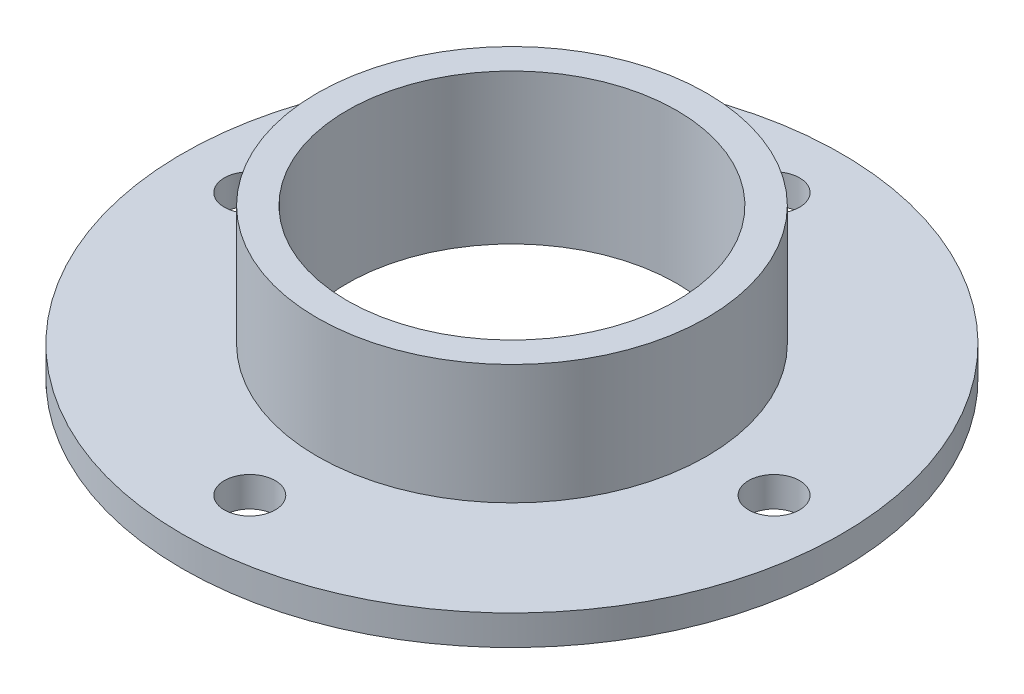
ISO-10303-21;
HEADER;
FILE_DESCRIPTION(('STEP AP214'),'2;1');
FILE_NAME('part.step','',(''),(''),'','','');
FILE_SCHEMA(('AUTOMOTIVE_DESIGN { 1 0 10303 214 1 1 1 1 }'));
ENDSEC;
DATA;
#1=APPLICATION_CONTEXT('core data for automotive mechanical design processes');
#2=APPLICATION_PROTOCOL_DEFINITION('international standard','automotive_design',2000,#1);
#3=PRODUCT_CONTEXT('',#1,'mechanical');
#4=PRODUCT('Part','Part','',(#3));
#5=PRODUCT_RELATED_PRODUCT_CATEGORY('part','',(#4));
#6=PRODUCT_DEFINITION_FORMATION('','',#4);
#7=PRODUCT_DEFINITION_CONTEXT('part definition',#1,'design');
#8=PRODUCT_DEFINITION('design','',#6,#7);
#9=PRODUCT_DEFINITION_SHAPE('','',#8);
#10=(LENGTH_UNIT() NAMED_UNIT(*) SI_UNIT(.MILLI.,.METRE.));
#11=(NAMED_UNIT(*) PLANE_ANGLE_UNIT() SI_UNIT($,.RADIAN.));
#12=(NAMED_UNIT(*) SI_UNIT($,.STERADIAN.) SOLID_ANGLE_UNIT());
#13=UNCERTAINTY_MEASURE_WITH_UNIT(LENGTH_MEASURE(1.E-05),#10,'distance_accuracy_value','');
#14=(GEOMETRIC_REPRESENTATION_CONTEXT(3) GLOBAL_UNCERTAINTY_ASSIGNED_CONTEXT((#13)) GLOBAL_UNIT_ASSIGNED_CONTEXT((#10,
#11,#12)) REPRESENTATION_CONTEXT('',''));
#15=CARTESIAN_POINT('',(0.,0.,0.));
#16=DIRECTION('',(0.,0.,1.));
#17=DIRECTION('',(1.,0.,0.));
#18=AXIS2_PLACEMENT_3D('',#15,#16,#17);
#19=CARTESIAN_POINT('',(0.,17.9540192467724,0.));
#20=DIRECTION('',(0.,1.,0.));
#21=DIRECTION('',(0.,0.,1.));
#22=AXIS2_PLACEMENT_3D('',#19,#20,#21);
#23=CYLINDRICAL_SURFACE('',#22,11.);
#24=CARTESIAN_POINT('',(0.,8.,0.));
#25=DIRECTION('',(0.,1.,0.));
#26=DIRECTION('',(0.,0.,1.));
#27=AXIS2_PLACEMENT_3D('',#24,#25,#26);
#28=CIRCLE('',#27,11.);
#29=CARTESIAN_POINT('',(0.,8.,11.));
#30=VERTEX_POINT('',#29);
#31=EDGE_CURVE('E10',#30,#30,#28,.T.);
#32=ORIENTED_EDGE('',*,*,#31,.T.);
#33=EDGE_LOOP('',(#32));
#34=FACE_BOUND('',#33,.T.);
#35=CARTESIAN_POINT('',(0.,-2.,0.));
#36=DIRECTION('',(0.,1.,0.));
#37=DIRECTION('',(0.,0.,1.));
#38=AXIS2_PLACEMENT_3D('',#35,#36,#37);
#39=CIRCLE('',#38,11.);
#40=CARTESIAN_POINT('',(0.,-2.,11.));
#41=VERTEX_POINT('',#40);
#42=EDGE_CURVE('E57',#41,#41,#39,.T.);
#43=ORIENTED_EDGE('',*,*,#42,.F.);
#44=EDGE_LOOP('',(#43));
#45=FACE_BOUND('',#44,.T.);
#46=ADVANCED_FACE('F35',(#34,#45),#23,.F.);
#47=CARTESIAN_POINT('',(11.,8.,0.));
#48=DIRECTION('',(0.,-1.,0.));
#49=DIRECTION('',(0.,0.,-1.));
#50=AXIS2_PLACEMENT_3D('',#47,#48,#49);
#51=PLANE('',#50);
#52=ORIENTED_EDGE('',*,*,#31,.F.);
#53=EDGE_LOOP('',(#52));
#54=FACE_BOUND('',#53,.T.);
#55=CARTESIAN_POINT('',(0.,8.,0.));
#56=DIRECTION('',(0.,1.,0.));
#57=DIRECTION('',(0.,0.,1.));
#58=AXIS2_PLACEMENT_3D('',#55,#56,#57);
#59=CIRCLE('',#58,13.);
#60=CARTESIAN_POINT('',(0.,8.,13.));
#61=VERTEX_POINT('',#60);
#62=EDGE_CURVE('E41',#61,#61,#59,.T.);
#63=ORIENTED_EDGE('',*,*,#62,.T.);
#64=EDGE_LOOP('',(#63));
#65=FACE_BOUND('',#64,.T.);
#66=ADVANCED_FACE('F121',(#54,#65),#51,.F.);
#67=CARTESIAN_POINT('',(0.,17.9540192467724,0.));
#68=DIRECTION('',(0.,1.,0.));
#69=DIRECTION('',(0.,0.,1.));
#70=AXIS2_PLACEMENT_3D('',#67,#68,#69);
#71=CYLINDRICAL_SURFACE('',#70,13.);
#72=ORIENTED_EDGE('',*,*,#62,.F.);
#73=EDGE_LOOP('',(#72));
#74=FACE_BOUND('',#73,.T.);
#75=CARTESIAN_POINT('',(0.,0.,0.));
#76=DIRECTION('',(0.,1.,0.));
#77=DIRECTION('',(0.,0.,1.));
#78=AXIS2_PLACEMENT_3D('',#75,#76,#77);
#79=CIRCLE('',#78,13.);
#80=CARTESIAN_POINT('',(0.,0.,13.));
#81=VERTEX_POINT('',#80);
#82=EDGE_CURVE('E45',#81,#81,#79,.T.);
#83=ORIENTED_EDGE('',*,*,#82,.T.);
#84=EDGE_LOOP('',(#83));
#85=FACE_BOUND('',#84,.T.);
#86=ADVANCED_FACE('F91',(#74,#85),#71,.T.);
#87=CARTESIAN_POINT('',(13.,0.,0.));
#88=DIRECTION('',(0.,-1.,0.));
#89=DIRECTION('',(0.,0.,-1.));
#90=AXIS2_PLACEMENT_3D('',#87,#88,#89);
#91=PLANE('',#90);
#92=CARTESIAN_POINT('',(0.,0.,-17.5));
#93=DIRECTION('',(0.,1.,0.));
#94=DIRECTION('',(0.,0.,1.));
#95=AXIS2_PLACEMENT_3D('',#92,#93,#94);
#96=CIRCLE('',#95,1.7);
#97=CARTESIAN_POINT('',(0.,0.,-15.8));
#98=VERTEX_POINT('',#97);
#99=EDGE_CURVE('E81',#98,#98,#96,.T.);
#100=ORIENTED_EDGE('',*,*,#99,.F.);
#101=EDGE_LOOP('',(#100));
#102=FACE_BOUND('',#101,.T.);
#103=CARTESIAN_POINT('',(17.5,0.,0.));
#104=DIRECTION('',(0.,1.,0.));
#105=DIRECTION('',(0.,0.,1.));
#106=AXIS2_PLACEMENT_3D('',#103,#104,#105);
#107=CIRCLE('',#106,1.7);
#108=CARTESIAN_POINT('',(17.5,0.,1.7));
#109=VERTEX_POINT('',#108);
#110=EDGE_CURVE('E75',#109,#109,#107,.T.);
#111=ORIENTED_EDGE('',*,*,#110,.F.);
#112=EDGE_LOOP('',(#111));
#113=FACE_BOUND('',#112,.T.);
#114=CARTESIAN_POINT('',(0.,0.,17.5));
#115=DIRECTION('',(0.,1.,0.));
#116=DIRECTION('',(0.,0.,1.));
#117=AXIS2_PLACEMENT_3D('',#114,#115,#116);
#118=CIRCLE('',#117,1.7);
#119=CARTESIAN_POINT('',(0.,0.,19.2));
#120=VERTEX_POINT('',#119);
#121=EDGE_CURVE('E69',#120,#120,#118,.T.);
#122=ORIENTED_EDGE('',*,*,#121,.F.);
#123=EDGE_LOOP('',(#122));
#124=FACE_BOUND('',#123,.T.);
#125=CARTESIAN_POINT('',(-17.5,0.,0.));
#126=DIRECTION('',(0.,1.,0.));
#127=DIRECTION('',(0.,0.,1.));
#128=AXIS2_PLACEMENT_3D('',#125,#126,#127);
#129=CIRCLE('',#128,1.7);
#130=CARTESIAN_POINT('',(-17.5,0.,1.7));
#131=VERTEX_POINT('',#130);
#132=EDGE_CURVE('E63',#131,#131,#129,.T.);
#133=ORIENTED_EDGE('',*,*,#132,.F.);
#134=EDGE_LOOP('',(#133));
#135=FACE_BOUND('',#134,.T.);
#136=ORIENTED_EDGE('',*,*,#82,.F.);
#137=EDGE_LOOP('',(#136));
#138=FACE_BOUND('',#137,.T.);
#139=CARTESIAN_POINT('',(0.,0.,0.));
#140=DIRECTION('',(0.,1.,0.));
#141=DIRECTION('',(0.,0.,1.));
#142=AXIS2_PLACEMENT_3D('',#139,#140,#141);
#143=CIRCLE('',#142,22.);
#144=CARTESIAN_POINT('',(0.,0.,22.));
#145=VERTEX_POINT('',#144);
#146=EDGE_CURVE('E49',#145,#145,#143,.T.);
#147=ORIENTED_EDGE('',*,*,#146,.T.);
#148=EDGE_LOOP('',(#147));
#149=FACE_BOUND('',#148,.T.);
#150=ADVANCED_FACE('F87',(#102,#113,#124,#135,#138,#149),#91,.F.);
#151=CARTESIAN_POINT('',(0.,17.9540192467724,0.));
#152=DIRECTION('',(0.,1.,0.));
#153=DIRECTION('',(0.,0.,1.));
#154=AXIS2_PLACEMENT_3D('',#151,#152,#153);
#155=CYLINDRICAL_SURFACE('',#154,22.);
#156=ORIENTED_EDGE('',*,*,#146,.F.);
#157=EDGE_LOOP('',(#156));
#158=FACE_BOUND('',#157,.T.);
#159=CARTESIAN_POINT('',(0.,-2.,0.));
#160=DIRECTION('',(0.,1.,0.));
#161=DIRECTION('',(0.,0.,1.));
#162=AXIS2_PLACEMENT_3D('',#159,#160,#161);
#163=CIRCLE('',#162,22.);
#164=CARTESIAN_POINT('',(0.,-2.,22.));
#165=VERTEX_POINT('',#164);
#166=EDGE_CURVE('E54',#165,#165,#163,.T.);
#167=ORIENTED_EDGE('',*,*,#166,.T.);
#168=EDGE_LOOP('',(#167));
#169=FACE_BOUND('',#168,.T.);
#170=ADVANCED_FACE('F90',(#158,#169),#155,.T.);
#171=CARTESIAN_POINT('',(22.,-2.,0.));
#172=DIRECTION('',(0.,1.,0.));
#173=DIRECTION('',(0.,0.,1.));
#174=AXIS2_PLACEMENT_3D('',#171,#172,#173);
#175=PLANE('',#174);
#176=CARTESIAN_POINT('',(0.,-2.,-17.5));
#177=DIRECTION('',(0.,1.,0.));
#178=DIRECTION('',(0.,0.,1.));
#179=AXIS2_PLACEMENT_3D('',#176,#177,#178);
#180=CIRCLE('',#179,1.7);
#181=CARTESIAN_POINT('',(0.,-2.,-15.8));
#182=VERTEX_POINT('',#181);
#183=EDGE_CURVE('E78',#182,#182,#180,.T.);
#184=ORIENTED_EDGE('',*,*,#183,.T.);
#185=EDGE_LOOP('',(#184));
#186=FACE_BOUND('',#185,.T.);
#187=CARTESIAN_POINT('',(17.5,-2.,0.));
#188=DIRECTION('',(0.,1.,0.));
#189=DIRECTION('',(0.,0.,1.));
#190=AXIS2_PLACEMENT_3D('',#187,#188,#189);
#191=CIRCLE('',#190,1.7);
#192=CARTESIAN_POINT('',(17.5,-2.,1.7));
#193=VERTEX_POINT('',#192);
#194=EDGE_CURVE('E72',#193,#193,#191,.T.);
#195=ORIENTED_EDGE('',*,*,#194,.T.);
#196=EDGE_LOOP('',(#195));
#197=FACE_BOUND('',#196,.T.);
#198=CARTESIAN_POINT('',(0.,-2.,17.5));
#199=DIRECTION('',(0.,1.,0.));
#200=DIRECTION('',(0.,0.,1.));
#201=AXIS2_PLACEMENT_3D('',#198,#199,#200);
#202=CIRCLE('',#201,1.7);
#203=CARTESIAN_POINT('',(0.,-2.,19.2));
#204=VERTEX_POINT('',#203);
#205=EDGE_CURVE('E66',#204,#204,#202,.T.);
#206=ORIENTED_EDGE('',*,*,#205,.T.);
#207=EDGE_LOOP('',(#206));
#208=FACE_BOUND('',#207,.T.);
#209=CARTESIAN_POINT('',(-17.5,-2.,0.));
#210=DIRECTION('',(0.,1.,0.));
#211=DIRECTION('',(0.,0.,1.));
#212=AXIS2_PLACEMENT_3D('',#209,#210,#211);
#213=CIRCLE('',#212,1.7);
#214=CARTESIAN_POINT('',(-17.5,-2.,1.7));
#215=VERTEX_POINT('',#214);
#216=EDGE_CURVE('E60',#215,#215,#213,.T.);
#217=ORIENTED_EDGE('',*,*,#216,.T.);
#218=EDGE_LOOP('',(#217));
#219=FACE_BOUND('',#218,.T.);
#220=ORIENTED_EDGE('',*,*,#42,.T.);
#221=EDGE_LOOP('',(#220));
#222=FACE_BOUND('',#221,.T.);
#223=ORIENTED_EDGE('',*,*,#166,.F.);
#224=EDGE_LOOP('',(#223));
#225=FACE_BOUND('',#224,.T.);
#226=ADVANCED_FACE('F105',(#186,#197,#208,#219,#222,#225),#175,.F.);
#227=CARTESIAN_POINT('',(-17.5,0.,0.));
#228=DIRECTION('',(0.,1.,0.));
#229=DIRECTION('',(0.,0.,1.));
#230=AXIS2_PLACEMENT_3D('',#227,#228,#229);
#231=CYLINDRICAL_SURFACE('',#230,1.7);
#232=ORIENTED_EDGE('',*,*,#216,.F.);
#233=EDGE_LOOP('',(#232));
#234=FACE_BOUND('',#233,.T.);
#235=ORIENTED_EDGE('',*,*,#132,.T.);
#236=EDGE_LOOP('',(#235));
#237=FACE_BOUND('',#236,.T.);
#238=ADVANCED_FACE('F110',(#234,#237),#231,.F.);
#239=CARTESIAN_POINT('',(0.,0.,17.5));
#240=DIRECTION('',(0.,1.,0.));
#241=DIRECTION('',(0.,0.,1.));
#242=AXIS2_PLACEMENT_3D('',#239,#240,#241);
#243=CYLINDRICAL_SURFACE('',#242,1.7);
#244=ORIENTED_EDGE('',*,*,#205,.F.);
#245=EDGE_LOOP('',(#244));
#246=FACE_BOUND('',#245,.T.);
#247=ORIENTED_EDGE('',*,*,#121,.T.);
#248=EDGE_LOOP('',(#247));
#249=FACE_BOUND('',#248,.T.);
#250=ADVANCED_FACE('F116',(#246,#249),#243,.F.);
#251=CARTESIAN_POINT('',(17.5,0.,0.));
#252=DIRECTION('',(0.,1.,0.));
#253=DIRECTION('',(0.,0.,1.));
#254=AXIS2_PLACEMENT_3D('',#251,#252,#253);
#255=CYLINDRICAL_SURFACE('',#254,1.7);
#256=ORIENTED_EDGE('',*,*,#194,.F.);
#257=EDGE_LOOP('',(#256));
#258=FACE_BOUND('',#257,.T.);
#259=ORIENTED_EDGE('',*,*,#110,.T.);
#260=EDGE_LOOP('',(#259));
#261=FACE_BOUND('',#260,.T.);
#262=ADVANCED_FACE('F171',(#258,#261),#255,.F.);
#263=CARTESIAN_POINT('',(0.,0.,-17.5));
#264=DIRECTION('',(0.,1.,0.));
#265=DIRECTION('',(0.,0.,1.));
#266=AXIS2_PLACEMENT_3D('',#263,#264,#265);
#267=CYLINDRICAL_SURFACE('',#266,1.7);
#268=ORIENTED_EDGE('',*,*,#183,.F.);
#269=EDGE_LOOP('',(#268));
#270=FACE_BOUND('',#269,.T.);
#271=ORIENTED_EDGE('',*,*,#99,.T.);
#272=EDGE_LOOP('',(#271));
#273=FACE_BOUND('',#272,.T.);
#274=ADVANCED_FACE('F85',(#270,#273),#267,.F.);
#275=CLOSED_SHELL('',(#46,#66,#86,#150,#170,#226,#238,#250,#262,#274));
#276=MANIFOLD_SOLID_BREP('B2',#275);
#277=ADVANCED_BREP_SHAPE_REPRESENTATION('',(#18,#276),#14);
#278=SHAPE_DEFINITION_REPRESENTATION(#9,#277);
ENDSEC;
END-ISO-10303-21;
